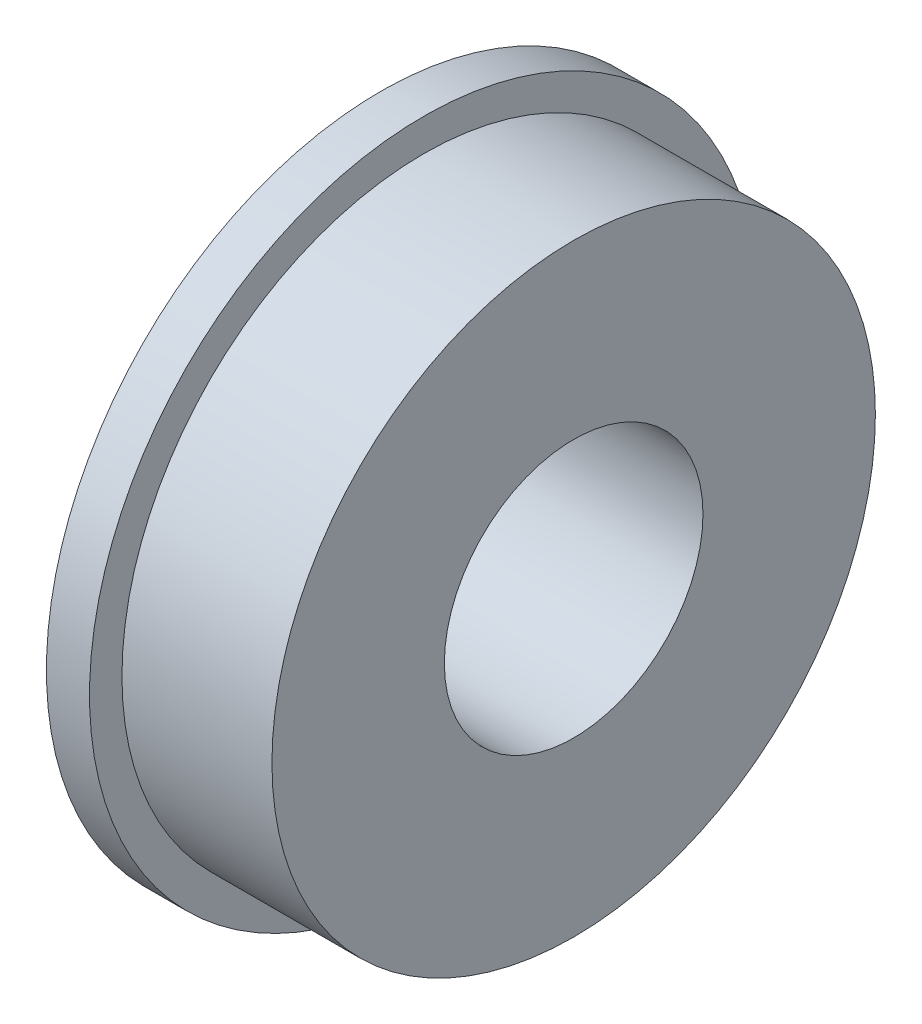
ISO-10303-21;
HEADER;
FILE_DESCRIPTION(('STEP AP214'),'2;1');
FILE_NAME('part.step','',(''),(''),'','','');
FILE_SCHEMA(('AUTOMOTIVE_DESIGN { 1 0 10303 214 1 1 1 1 }'));
ENDSEC;
DATA;
#1=APPLICATION_CONTEXT('core data for automotive mechanical design processes');
#2=APPLICATION_PROTOCOL_DEFINITION('international standard','automotive_design',2000,#1);
#3=PRODUCT_CONTEXT('',#1,'mechanical');
#4=PRODUCT('Part','Part','',(#3));
#5=PRODUCT_RELATED_PRODUCT_CATEGORY('part','',(#4));
#6=PRODUCT_DEFINITION_FORMATION('','',#4);
#7=PRODUCT_DEFINITION_CONTEXT('part definition',#1,'design');
#8=PRODUCT_DEFINITION('design','',#6,#7);
#9=PRODUCT_DEFINITION_SHAPE('','',#8);
#10=(LENGTH_UNIT() NAMED_UNIT(*) SI_UNIT(.MILLI.,.METRE.));
#11=(NAMED_UNIT(*) PLANE_ANGLE_UNIT() SI_UNIT($,.RADIAN.));
#12=(NAMED_UNIT(*) SI_UNIT($,.STERADIAN.) SOLID_ANGLE_UNIT());
#13=UNCERTAINTY_MEASURE_WITH_UNIT(LENGTH_MEASURE(1.E-05),#10,'distance_accuracy_value','');
#14=(GEOMETRIC_REPRESENTATION_CONTEXT(3) GLOBAL_UNCERTAINTY_ASSIGNED_CONTEXT((#13)) GLOBAL_UNIT_ASSIGNED_CONTEXT((#10,
#11,#12)) REPRESENTATION_CONTEXT('',''));
#15=CARTESIAN_POINT('',(0.,0.,0.));
#16=DIRECTION('',(0.,0.,1.));
#17=DIRECTION('',(1.,0.,0.));
#18=AXIS2_PLACEMENT_3D('',#15,#16,#17);
#19=CARTESIAN_POINT('',(7.112,0.,0.));
#20=DIRECTION('',(-1.,0.,0.));
#21=DIRECTION('',(0.,0.,-1.));
#22=AXIS2_PLACEMENT_3D('',#19,#20,#21);
#23=CYLINDRICAL_SURFACE('',#22,6.35);
#24=CARTESIAN_POINT('',(0.381,0.,0.));
#25=DIRECTION('',(1.,0.,0.));
#26=DIRECTION('',(0.,0.,-1.));
#27=AXIS2_PLACEMENT_3D('',#24,#25,#26);
#28=CIRCLE('',#27,6.35);
#29=CARTESIAN_POINT('',(0.381,0.,-6.35));
#30=VERTEX_POINT('',#29);
#31=EDGE_CURVE('E67',#30,#30,#28,.T.);
#32=ORIENTED_EDGE('',*,*,#31,.F.);
#33=EDGE_LOOP('',(#32));
#34=FACE_BOUND('',#33,.T.);
#35=CARTESIAN_POINT('',(0.,0.,0.));
#36=DIRECTION('',(1.,0.,0.));
#37=DIRECTION('',(0.,0.,-1.));
#38=AXIS2_PLACEMENT_3D('',#35,#36,#37);
#39=CIRCLE('',#38,6.35);
#40=CARTESIAN_POINT('',(0.,0.,-6.35));
#41=VERTEX_POINT('',#40);
#42=EDGE_CURVE('E10',#41,#41,#39,.T.);
#43=ORIENTED_EDGE('',*,*,#42,.T.);
#44=EDGE_LOOP('',(#43));
#45=FACE_BOUND('',#44,.T.);
#46=ADVANCED_FACE('F33',(#34,#45),#23,.T.);
#47=CARTESIAN_POINT('',(0.,4.7625,0.));
#48=DIRECTION('',(-1.,0.,0.));
#49=DIRECTION('',(0.,0.,-1.));
#50=AXIS2_PLACEMENT_3D('',#47,#48,#49);
#51=PLANE('',#50);
#52=ORIENTED_EDGE('',*,*,#42,.F.);
#53=EDGE_LOOP('',(#52));
#54=FACE_BOUND('',#53,.T.);
#55=CARTESIAN_POINT('',(0.,0.,0.));
#56=DIRECTION('',(1.,0.,0.));
#57=DIRECTION('',(0.,0.,-1.));
#58=AXIS2_PLACEMENT_3D('',#55,#56,#57);
#59=CIRCLE('',#58,4.7625);
#60=CARTESIAN_POINT('',(0.,0.,-4.7625));
#61=VERTEX_POINT('',#60);
#62=EDGE_CURVE('E39',#61,#61,#59,.T.);
#63=ORIENTED_EDGE('',*,*,#62,.T.);
#64=EDGE_LOOP('',(#63));
#65=FACE_BOUND('',#64,.T.);
#66=ADVANCED_FACE('F74',(#54,#65),#51,.T.);
#67=CARTESIAN_POINT('',(7.112,0.,0.));
#68=DIRECTION('',(-1.,0.,0.));
#69=DIRECTION('',(0.,0.,-1.));
#70=AXIS2_PLACEMENT_3D('',#67,#68,#69);
#71=CYLINDRICAL_SURFACE('',#70,4.7625);
#72=ORIENTED_EDGE('',*,*,#62,.F.);
#73=EDGE_LOOP('',(#72));
#74=FACE_BOUND('',#73,.T.);
#75=CARTESIAN_POINT('',(7.112,0.,0.));
#76=DIRECTION('',(1.,0.,0.));
#77=DIRECTION('',(0.,0.,-1.));
#78=AXIS2_PLACEMENT_3D('',#75,#76,#77);
#79=CIRCLE('',#78,4.7625);
#80=CARTESIAN_POINT('',(7.112,0.,-4.7625));
#81=VERTEX_POINT('',#80);
#82=EDGE_CURVE('E43',#81,#81,#79,.T.);
#83=ORIENTED_EDGE('',*,*,#82,.T.);
#84=EDGE_LOOP('',(#83));
#85=FACE_BOUND('',#84,.T.);
#86=ADVANCED_FACE('F78',(#74,#85),#71,.F.);
#87=CARTESIAN_POINT('',(7.112,11.1125,0.));
#88=DIRECTION('',(1.,0.,0.));
#89=DIRECTION('',(0.,0.,1.));
#90=AXIS2_PLACEMENT_3D('',#87,#88,#89);
#91=PLANE('',#90);
#92=ORIENTED_EDGE('',*,*,#82,.F.);
#93=EDGE_LOOP('',(#92));
#94=FACE_BOUND('',#93,.T.);
#95=CARTESIAN_POINT('',(7.112,0.,0.));
#96=DIRECTION('',(1.,0.,0.));
#97=DIRECTION('',(0.,0.,-1.));
#98=AXIS2_PLACEMENT_3D('',#95,#96,#97);
#99=CIRCLE('',#98,11.1125);
#100=CARTESIAN_POINT('',(7.112,0.,-11.1125));
#101=VERTEX_POINT('',#100);
#102=EDGE_CURVE('E47',#101,#101,#99,.T.);
#103=ORIENTED_EDGE('',*,*,#102,.T.);
#104=EDGE_LOOP('',(#103));
#105=FACE_BOUND('',#104,.T.);
#106=ADVANCED_FACE('F83',(#94,#105),#91,.T.);
#107=CARTESIAN_POINT('',(7.112,0.,0.));
#108=DIRECTION('',(-1.,0.,0.));
#109=DIRECTION('',(0.,0.,-1.));
#110=AXIS2_PLACEMENT_3D('',#107,#108,#109);
#111=CYLINDRICAL_SURFACE('',#110,11.1125);
#112=ORIENTED_EDGE('',*,*,#102,.F.);
#113=EDGE_LOOP('',(#112));
#114=FACE_BOUND('',#113,.T.);
#115=CARTESIAN_POINT('',(1.5875,0.,0.));
#116=DIRECTION('',(1.,0.,0.));
#117=DIRECTION('',(0.,0.,-1.));
#118=AXIS2_PLACEMENT_3D('',#115,#116,#117);
#119=CIRCLE('',#118,11.1125);
#120=CARTESIAN_POINT('',(1.5875,0.,-11.1125));
#121=VERTEX_POINT('',#120);
#122=EDGE_CURVE('E52',#121,#121,#119,.T.);
#123=ORIENTED_EDGE('',*,*,#122,.T.);
#124=EDGE_LOOP('',(#123));
#125=FACE_BOUND('',#124,.T.);
#126=ADVANCED_FACE('F89',(#114,#125),#111,.T.);
#127=CARTESIAN_POINT('',(1.5875,12.3063,0.));
#128=DIRECTION('',(1.,0.,0.));
#129=DIRECTION('',(0.,0.,1.));
#130=AXIS2_PLACEMENT_3D('',#127,#128,#129);
#131=PLANE('',#130);
#132=ORIENTED_EDGE('',*,*,#122,.F.);
#133=EDGE_LOOP('',(#132));
#134=FACE_BOUND('',#133,.T.);
#135=CARTESIAN_POINT('',(1.5875,0.,0.));
#136=DIRECTION('',(1.,0.,0.));
#137=DIRECTION('',(0.,0.,-1.));
#138=AXIS2_PLACEMENT_3D('',#135,#136,#137);
#139=CIRCLE('',#138,12.3063);
#140=CARTESIAN_POINT('',(1.5875,0.,-12.3063));
#141=VERTEX_POINT('',#140);
#142=EDGE_CURVE('E55',#141,#141,#139,.T.);
#143=ORIENTED_EDGE('',*,*,#142,.T.);
#144=EDGE_LOOP('',(#143));
#145=FACE_BOUND('',#144,.T.);
#146=ADVANCED_FACE('F93',(#134,#145),#131,.T.);
#147=CARTESIAN_POINT('',(7.112,0.,0.));
#148=DIRECTION('',(-1.,0.,0.));
#149=DIRECTION('',(0.,0.,-1.));
#150=AXIS2_PLACEMENT_3D('',#147,#148,#149);
#151=CYLINDRICAL_SURFACE('',#150,12.3063);
#152=ORIENTED_EDGE('',*,*,#142,.F.);
#153=EDGE_LOOP('',(#152));
#154=FACE_BOUND('',#153,.T.);
#155=CARTESIAN_POINT('',(0.,0.,0.));
#156=DIRECTION('',(1.,0.,0.));
#157=DIRECTION('',(0.,0.,-1.));
#158=AXIS2_PLACEMENT_3D('',#155,#156,#157);
#159=CIRCLE('',#158,12.3063);
#160=CARTESIAN_POINT('',(0.,0.,-12.3063));
#161=VERTEX_POINT('',#160);
#162=EDGE_CURVE('E58',#161,#161,#159,.T.);
#163=ORIENTED_EDGE('',*,*,#162,.T.);
#164=EDGE_LOOP('',(#163));
#165=FACE_BOUND('',#164,.T.);
#166=ADVANCED_FACE('F97',(#154,#165),#151,.T.);
#167=CARTESIAN_POINT('',(0.,9.906,0.));
#168=DIRECTION('',(-1.,0.,0.));
#169=DIRECTION('',(0.,0.,-1.));
#170=AXIS2_PLACEMENT_3D('',#167,#168,#169);
#171=PLANE('',#170);
#172=ORIENTED_EDGE('',*,*,#162,.F.);
#173=EDGE_LOOP('',(#172));
#174=FACE_BOUND('',#173,.T.);
#175=CARTESIAN_POINT('',(0.,0.,0.));
#176=DIRECTION('',(1.,0.,0.));
#177=DIRECTION('',(0.,0.,-1.));
#178=AXIS2_PLACEMENT_3D('',#175,#176,#177);
#179=CIRCLE('',#178,9.906);
#180=CARTESIAN_POINT('',(0.,0.,-9.906));
#181=VERTEX_POINT('',#180);
#182=EDGE_CURVE('E61',#181,#181,#179,.T.);
#183=ORIENTED_EDGE('',*,*,#182,.T.);
#184=EDGE_LOOP('',(#183));
#185=FACE_BOUND('',#184,.T.);
#186=ADVANCED_FACE('F101',(#174,#185),#171,.T.);
#187=CARTESIAN_POINT('',(7.112,0.,0.));
#188=DIRECTION('',(-1.,0.,0.));
#189=DIRECTION('',(0.,0.,-1.));
#190=AXIS2_PLACEMENT_3D('',#187,#188,#189);
#191=CYLINDRICAL_SURFACE('',#190,9.906);
#192=ORIENTED_EDGE('',*,*,#182,.F.);
#193=EDGE_LOOP('',(#192));
#194=FACE_BOUND('',#193,.T.);
#195=CARTESIAN_POINT('',(0.380999999999999,0.,0.));
#196=DIRECTION('',(1.,0.,0.));
#197=DIRECTION('',(0.,0.,-1.));
#198=AXIS2_PLACEMENT_3D('',#195,#196,#197);
#199=CIRCLE('',#198,9.906);
#200=CARTESIAN_POINT('',(0.380999999999999,0.,-9.906));
#201=VERTEX_POINT('',#200);
#202=EDGE_CURVE('E64',#201,#201,#199,.T.);
#203=ORIENTED_EDGE('',*,*,#202,.T.);
#204=EDGE_LOOP('',(#203));
#205=FACE_BOUND('',#204,.T.);
#206=ADVANCED_FACE('F105',(#194,#205),#191,.F.);
#207=CARTESIAN_POINT('',(0.381,6.35,0.));
#208=DIRECTION('',(-1.,0.,0.));
#209=DIRECTION('',(0.,0.,-1.));
#210=AXIS2_PLACEMENT_3D('',#207,#208,#209);
#211=PLANE('',#210);
#212=ORIENTED_EDGE('',*,*,#202,.F.);
#213=EDGE_LOOP('',(#212));
#214=FACE_BOUND('',#213,.T.);
#215=ORIENTED_EDGE('',*,*,#31,.T.);
#216=EDGE_LOOP('',(#215));
#217=FACE_BOUND('',#216,.T.);
#218=ADVANCED_FACE('F71',(#214,#217),#211,.T.);
#219=CLOSED_SHELL('',(#46,#66,#86,#106,#126,#146,#166,#186,#206,#218));
#220=MANIFOLD_SOLID_BREP('B2',#219);
#221=ADVANCED_BREP_SHAPE_REPRESENTATION('',(#18,#220),#14);
#222=SHAPE_DEFINITION_REPRESENTATION(#9,#221);
ENDSEC;
END-ISO-10303-21;
